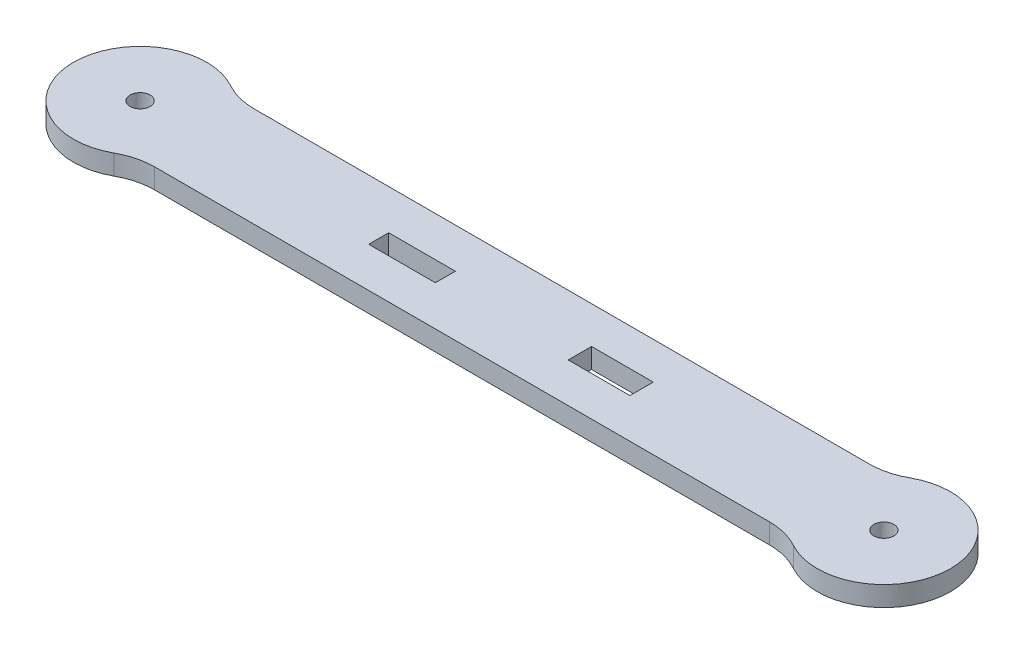
ISO-10303-21;
HEADER;
FILE_DESCRIPTION(('STEP AP214'),'2;1');
FILE_NAME('part.step','',(''),(''),'','','');
FILE_SCHEMA(('AUTOMOTIVE_DESIGN { 1 0 10303 214 1 1 1 1 }'));
ENDSEC;
DATA;
#1=APPLICATION_CONTEXT('core data for automotive mechanical design processes');
#2=APPLICATION_PROTOCOL_DEFINITION('international standard','automotive_design',2000,#1);
#3=PRODUCT_CONTEXT('',#1,'mechanical');
#4=PRODUCT('Part','Part','',(#3));
#5=PRODUCT_RELATED_PRODUCT_CATEGORY('part','',(#4));
#6=PRODUCT_DEFINITION_FORMATION('','',#4);
#7=PRODUCT_DEFINITION_CONTEXT('part definition',#1,'design');
#8=PRODUCT_DEFINITION('design','',#6,#7);
#9=PRODUCT_DEFINITION_SHAPE('','',#8);
#10=(LENGTH_UNIT() NAMED_UNIT(*) SI_UNIT(.MILLI.,.METRE.));
#11=(NAMED_UNIT(*) PLANE_ANGLE_UNIT() SI_UNIT($,.RADIAN.));
#12=(NAMED_UNIT(*) SI_UNIT($,.STERADIAN.) SOLID_ANGLE_UNIT());
#13=UNCERTAINTY_MEASURE_WITH_UNIT(LENGTH_MEASURE(1.E-05),#10,'distance_accuracy_value','');
#14=(GEOMETRIC_REPRESENTATION_CONTEXT(3) GLOBAL_UNCERTAINTY_ASSIGNED_CONTEXT((#13)) GLOBAL_UNIT_ASSIGNED_CONTEXT((#10,
#11,#12)) REPRESENTATION_CONTEXT('',''));
#15=CARTESIAN_POINT('',(0.,0.,0.));
#16=DIRECTION('',(0.,0.,1.));
#17=DIRECTION('',(1.,0.,0.));
#18=AXIS2_PLACEMENT_3D('',#15,#16,#17);
#19=CARTESIAN_POINT('',(-55.805615337507,3.,0.));
#20=DIRECTION('',(0.,1.,0.));
#21=DIRECTION('',(0.,0.,1.));
#22=AXIS2_PLACEMENT_3D('',#19,#20,#21);
#23=PLANE('',#22);
#24=CARTESIAN_POINT('',(-55.805615337507,3.,0.));
#25=DIRECTION('',(0.,1.,0.));
#26=DIRECTION('',(0.,0.,1.));
#27=AXIS2_PLACEMENT_3D('',#24,#25,#26);
#28=CIRCLE('',#27,1.5);
#29=CARTESIAN_POINT('',(-55.805615337507,3.,1.5));
#30=VERTEX_POINT('',#29);
#31=EDGE_CURVE('E259',#30,#30,#28,.T.);
#32=ORIENTED_EDGE('',*,*,#31,.F.);
#33=EDGE_LOOP('',(#32));
#34=FACE_BOUND('',#33,.T.);
#35=DIRECTION('',(-1.,0.,0.));
#36=VECTOR('',#35,1.);
#37=CARTESIAN_POINT('',(-49.1912370598455,3.,-7.5));
#38=LINE('',#37,#36);
#39=CARTESIAN_POINT('',(46.1231569719884,3.,-7.50000000000001));
#40=VERTEX_POINT('',#39);
#41=CARTESIAN_POINT('',(-46.1231569719884,3.,-7.5));
#42=VERTEX_POINT('',#41);
#43=EDGE_CURVE('E279',#40,#42,#38,.T.);
#44=ORIENTED_EDGE('',*,*,#43,.T.);
#45=CARTESIAN_POINT('',(-46.1231569719884,3.,-17.5));
#46=DIRECTION('',(0.,1.,0.));
#47=DIRECTION('',(0.,0.,1.));
#48=AXIS2_PLACEMENT_3D('',#45,#46,#47);
#49=CIRCLE('',#48,10.);
#50=CARTESIAN_POINT('',(-50.9643861547477,3.,-8.75));
#51=VERTEX_POINT('',#50);
#52=EDGE_CURVE('E11',#42,#51,#49,.F.);
#53=ORIENTED_EDGE('',*,*,#52,.T.);
#54=CARTESIAN_POINT('',(-55.805615337507,3.,0.));
#55=DIRECTION('',(0.,1.,0.));
#56=DIRECTION('',(0.,0.,1.));
#57=AXIS2_PLACEMENT_3D('',#54,#55,#56);
#58=CIRCLE('',#57,10.);
#59=CARTESIAN_POINT('',(-50.9643861547477,3.,8.75));
#60=VERTEX_POINT('',#59);
#61=EDGE_CURVE('E267',#51,#60,#58,.T.);
#62=ORIENTED_EDGE('',*,*,#61,.T.);
#63=CARTESIAN_POINT('',(-46.1231569719884,3.,17.5));
#64=DIRECTION('',(0.,1.,0.));
#65=DIRECTION('',(0.,0.,1.));
#66=AXIS2_PLACEMENT_3D('',#63,#64,#65);
#67=CIRCLE('',#66,10.);
#68=CARTESIAN_POINT('',(-46.1231569719884,3.,7.5));
#69=VERTEX_POINT('',#68);
#70=EDGE_CURVE('E331',#60,#69,#67,.F.);
#71=ORIENTED_EDGE('',*,*,#70,.T.);
#72=DIRECTION('',(1.,0.,0.));
#73=VECTOR('',#72,1.);
#74=CARTESIAN_POINT('',(-49.1912370598455,3.,7.5));
#75=LINE('',#74,#73);
#76=CARTESIAN_POINT('',(46.1231569719884,3.,7.49999999999999));
#77=VERTEX_POINT('',#76);
#78=EDGE_CURVE('E271',#69,#77,#75,.T.);
#79=ORIENTED_EDGE('',*,*,#78,.T.);
#80=CARTESIAN_POINT('',(46.1231569719884,3.,17.5));
#81=DIRECTION('',(0.,1.,0.));
#82=DIRECTION('',(0.,0.,1.));
#83=AXIS2_PLACEMENT_3D('',#80,#81,#82);
#84=CIRCLE('',#83,10.);
#85=CARTESIAN_POINT('',(50.9643861547477,3.,8.74999999999999));
#86=VERTEX_POINT('',#85);
#87=EDGE_CURVE('E325',#77,#86,#84,.F.);
#88=ORIENTED_EDGE('',*,*,#87,.T.);
#89=CARTESIAN_POINT('',(55.805615337507,3.,0.));
#90=DIRECTION('',(0.,1.,0.));
#91=DIRECTION('',(0.,0.,1.));
#92=AXIS2_PLACEMENT_3D('',#89,#90,#91);
#93=CIRCLE('',#92,10.);
#94=CARTESIAN_POINT('',(50.9643861547477,3.,-8.75000000000002));
#95=VERTEX_POINT('',#94);
#96=EDGE_CURVE('E276',#86,#95,#93,.T.);
#97=ORIENTED_EDGE('',*,*,#96,.T.);
#98=CARTESIAN_POINT('',(46.1231569719884,3.,-17.5));
#99=DIRECTION('',(0.,1.,0.));
#100=DIRECTION('',(0.,0.,1.));
#101=AXIS2_PLACEMENT_3D('',#98,#99,#100);
#102=CIRCLE('',#101,10.);
#103=EDGE_CURVE('E62',#95,#40,#102,.F.);
#104=ORIENTED_EDGE('',*,*,#103,.T.);
#105=EDGE_LOOP('',(#44,#53,#62,#71,#79,#88,#97,#104));
#106=FACE_BOUND('',#105,.T.);
#107=CARTESIAN_POINT('',(55.805615337507,3.,0.));
#108=DIRECTION('',(0.,1.,0.));
#109=DIRECTION('',(0.,0.,1.));
#110=AXIS2_PLACEMENT_3D('',#107,#108,#109);
#111=CIRCLE('',#110,1.5);
#112=CARTESIAN_POINT('',(55.805615337507,3.,1.49999999999999));
#113=VERTEX_POINT('',#112);
#114=EDGE_CURVE('E251',#113,#113,#111,.T.);
#115=ORIENTED_EDGE('',*,*,#114,.F.);
#116=EDGE_LOOP('',(#115));
#117=FACE_BOUND('',#116,.T.);
#118=DIRECTION('',(1.,0.,0.));
#119=VECTOR('',#118,1.);
#120=CARTESIAN_POINT('',(-20.,3.,1.5));
#121=LINE('',#120,#119);
#122=CARTESIAN_POINT('',(-20.,3.,1.5));
#123=VERTEX_POINT('',#122);
#124=CARTESIAN_POINT('',(-10.,3.,1.50000000000002));
#125=VERTEX_POINT('',#124);
#126=EDGE_CURVE('E211',#123,#125,#121,.T.);
#127=ORIENTED_EDGE('',*,*,#126,.F.);
#128=DIRECTION('',(0.,0.,1.));
#129=VECTOR('',#128,1.);
#130=CARTESIAN_POINT('',(-20.,3.,-1.5));
#131=LINE('',#130,#129);
#132=CARTESIAN_POINT('',(-20.,3.,-1.5));
#133=VERTEX_POINT('',#132);
#134=EDGE_CURVE('E208',#133,#123,#131,.T.);
#135=ORIENTED_EDGE('',*,*,#134,.F.);
#136=DIRECTION('',(-1.,0.,0.));
#137=VECTOR('',#136,1.);
#138=CARTESIAN_POINT('',(-20.,3.,-1.5));
#139=LINE('',#138,#137);
#140=CARTESIAN_POINT('',(-10.,3.,-1.5));
#141=VERTEX_POINT('',#140);
#142=EDGE_CURVE('E219',#141,#133,#139,.T.);
#143=ORIENTED_EDGE('',*,*,#142,.F.);
#144=DIRECTION('',(0.,0.,-1.));
#145=VECTOR('',#144,1.);
#146=CARTESIAN_POINT('',(-10.,3.,-1.5));
#147=LINE('',#146,#145);
#148=EDGE_CURVE('E215',#125,#141,#147,.T.);
#149=ORIENTED_EDGE('',*,*,#148,.F.);
#150=EDGE_LOOP('',(#127,#135,#143,#149));
#151=FACE_BOUND('',#150,.T.);
#152=DIRECTION('',(1.,0.,0.));
#153=VECTOR('',#152,1.);
#154=CARTESIAN_POINT('',(9.99999999999999,3.,1.56405872582707));
#155=LINE('',#154,#153);
#156=CARTESIAN_POINT('',(9.99999999999999,3.,1.56405872582707));
#157=VERTEX_POINT('',#156);
#158=CARTESIAN_POINT('',(19.2592276568958,3.,1.56405872582707));
#159=VERTEX_POINT('',#158);
#160=EDGE_CURVE('E166',#157,#159,#155,.T.);
#161=ORIENTED_EDGE('',*,*,#160,.F.);
#162=DIRECTION('',(0.,0.,1.));
#163=VECTOR('',#162,1.);
#164=CARTESIAN_POINT('',(9.99999999999999,3.,-1.93943282002539));
#165=LINE('',#164,#163);
#166=CARTESIAN_POINT('',(9.99999999999999,3.,-1.93943282002539));
#167=VERTEX_POINT('',#166);
#168=EDGE_CURVE('E155',#167,#157,#165,.T.);
#169=ORIENTED_EDGE('',*,*,#168,.F.);
#170=DIRECTION('',(-1.,0.,0.));
#171=VECTOR('',#170,1.);
#172=CARTESIAN_POINT('',(9.99999999999999,3.,-1.93943282002539));
#173=LINE('',#172,#171);
#174=CARTESIAN_POINT('',(19.2592276568958,3.,-1.93943282002539));
#175=VERTEX_POINT('',#174);
#176=EDGE_CURVE('E184',#175,#167,#173,.T.);
#177=ORIENTED_EDGE('',*,*,#176,.F.);
#178=DIRECTION('',(0.,0.,-1.));
#179=VECTOR('',#178,1.);
#180=CARTESIAN_POINT('',(19.2592276568958,3.,-1.93943282002539));
#181=LINE('',#180,#179);
#182=EDGE_CURVE('E180',#159,#175,#181,.T.);
#183=ORIENTED_EDGE('',*,*,#182,.F.);
#184=EDGE_LOOP('',(#161,#169,#177,#183));
#185=FACE_BOUND('',#184,.T.);
#186=ADVANCED_FACE('F39',(#34,#106,#117,#151,#185),#23,.T.);
#187=CARTESIAN_POINT('',(-55.805615337507,0.,0.));
#188=DIRECTION('',(0.,1.,0.));
#189=DIRECTION('',(0.,0.,1.));
#190=AXIS2_PLACEMENT_3D('',#187,#188,#189);
#191=PLANE('',#190);
#192=DIRECTION('',(0.,0.,1.));
#193=VECTOR('',#192,1.);
#194=CARTESIAN_POINT('',(-20.,0.,-1.5));
#195=LINE('',#194,#193);
#196=CARTESIAN_POINT('',(-20.,0.,-1.5));
#197=VERTEX_POINT('',#196);
#198=CARTESIAN_POINT('',(-20.,0.,1.5));
#199=VERTEX_POINT('',#198);
#200=EDGE_CURVE('E175',#197,#199,#195,.T.);
#201=ORIENTED_EDGE('',*,*,#200,.T.);
#202=DIRECTION('',(1.,0.,0.));
#203=VECTOR('',#202,1.);
#204=CARTESIAN_POINT('',(-20.,0.,1.5));
#205=LINE('',#204,#203);
#206=CARTESIAN_POINT('',(-10.,0.,1.50000000000002));
#207=VERTEX_POINT('',#206);
#208=EDGE_CURVE('E226',#199,#207,#205,.T.);
#209=ORIENTED_EDGE('',*,*,#208,.T.);
#210=DIRECTION('',(0.,0.,-1.));
#211=VECTOR('',#210,1.);
#212=CARTESIAN_POINT('',(-10.,0.,-1.5));
#213=LINE('',#212,#211);
#214=CARTESIAN_POINT('',(-10.,0.,-1.5));
#215=VERTEX_POINT('',#214);
#216=EDGE_CURVE('E230',#207,#215,#213,.T.);
#217=ORIENTED_EDGE('',*,*,#216,.T.);
#218=DIRECTION('',(-1.,0.,0.));
#219=VECTOR('',#218,1.);
#220=CARTESIAN_POINT('',(-20.,0.,-1.5));
#221=LINE('',#220,#219);
#222=EDGE_CURVE('E212',#215,#197,#221,.T.);
#223=ORIENTED_EDGE('',*,*,#222,.T.);
#224=EDGE_LOOP('',(#201,#209,#217,#223));
#225=FACE_BOUND('',#224,.T.);
#226=CARTESIAN_POINT('',(-55.805615337507,0.,0.));
#227=DIRECTION('',(0.,1.,0.));
#228=DIRECTION('',(0.,0.,1.));
#229=AXIS2_PLACEMENT_3D('',#226,#227,#228);
#230=CIRCLE('',#229,10.);
#231=CARTESIAN_POINT('',(-50.9643861547477,0.,-8.75));
#232=VERTEX_POINT('',#231);
#233=CARTESIAN_POINT('',(-50.9643861547477,0.,8.75));
#234=VERTEX_POINT('',#233);
#235=EDGE_CURVE('E263',#232,#234,#230,.T.);
#236=ORIENTED_EDGE('',*,*,#235,.F.);
#237=CARTESIAN_POINT('',(-46.1231569719884,0.,-17.5));
#238=DIRECTION('',(0.,1.,0.));
#239=DIRECTION('',(0.,0.,1.));
#240=AXIS2_PLACEMENT_3D('',#237,#238,#239);
#241=CIRCLE('',#240,10.);
#242=CARTESIAN_POINT('',(-46.1231569719884,0.,-7.5));
#243=VERTEX_POINT('',#242);
#244=EDGE_CURVE('E48',#232,#243,#241,.T.);
#245=ORIENTED_EDGE('',*,*,#244,.T.);
#246=DIRECTION('',(-1.,0.,0.));
#247=VECTOR('',#246,1.);
#248=CARTESIAN_POINT('',(-49.1912370598455,0.,-7.5));
#249=LINE('',#248,#247);
#250=CARTESIAN_POINT('',(46.1231569719884,0.,-7.50000000000001));
#251=VERTEX_POINT('',#250);
#252=EDGE_CURVE('E272',#251,#243,#249,.T.);
#253=ORIENTED_EDGE('',*,*,#252,.F.);
#254=CARTESIAN_POINT('',(46.1231569719884,0.,-17.5));
#255=DIRECTION('',(0.,1.,0.));
#256=DIRECTION('',(0.,0.,1.));
#257=AXIS2_PLACEMENT_3D('',#254,#255,#256);
#258=CIRCLE('',#257,10.);
#259=CARTESIAN_POINT('',(50.9643861547477,0.,-8.75000000000002));
#260=VERTEX_POINT('',#259);
#261=EDGE_CURVE('E334',#251,#260,#258,.T.);
#262=ORIENTED_EDGE('',*,*,#261,.T.);
#263=CARTESIAN_POINT('',(55.805615337507,0.,0.));
#264=DIRECTION('',(0.,1.,0.));
#265=DIRECTION('',(0.,0.,1.));
#266=AXIS2_PLACEMENT_3D('',#263,#264,#265);
#267=CIRCLE('',#266,10.);
#268=CARTESIAN_POINT('',(50.9643861547477,0.,8.74999999999999));
#269=VERTEX_POINT('',#268);
#270=EDGE_CURVE('E290',#269,#260,#267,.T.);
#271=ORIENTED_EDGE('',*,*,#270,.F.);
#272=CARTESIAN_POINT('',(46.1231569719884,0.,17.5));
#273=DIRECTION('',(0.,1.,0.));
#274=DIRECTION('',(0.,0.,1.));
#275=AXIS2_PLACEMENT_3D('',#272,#273,#274);
#276=CIRCLE('',#275,10.);
#277=CARTESIAN_POINT('',(46.1231569719884,0.,7.49999999999999));
#278=VERTEX_POINT('',#277);
#279=EDGE_CURVE('E322',#269,#278,#276,.T.);
#280=ORIENTED_EDGE('',*,*,#279,.T.);
#281=DIRECTION('',(1.,0.,0.));
#282=VECTOR('',#281,1.);
#283=CARTESIAN_POINT('',(-49.1912370598455,0.,7.5));
#284=LINE('',#283,#282);
#285=CARTESIAN_POINT('',(-46.1231569719884,0.,7.5));
#286=VERTEX_POINT('',#285);
#287=EDGE_CURVE('E286',#286,#278,#284,.T.);
#288=ORIENTED_EDGE('',*,*,#287,.F.);
#289=CARTESIAN_POINT('',(-46.1231569719884,0.,17.5));
#290=DIRECTION('',(0.,1.,0.));
#291=DIRECTION('',(0.,0.,1.));
#292=AXIS2_PLACEMENT_3D('',#289,#290,#291);
#293=CIRCLE('',#292,10.);
#294=EDGE_CURVE('E328',#286,#234,#293,.T.);
#295=ORIENTED_EDGE('',*,*,#294,.T.);
#296=EDGE_LOOP('',(#236,#245,#253,#262,#271,#280,#288,#295));
#297=FACE_BOUND('',#296,.T.);
#298=CARTESIAN_POINT('',(-55.805615337507,0.,0.));
#299=DIRECTION('',(0.,1.,0.));
#300=DIRECTION('',(0.,0.,1.));
#301=AXIS2_PLACEMENT_3D('',#298,#299,#300);
#302=CIRCLE('',#301,1.5);
#303=CARTESIAN_POINT('',(-55.805615337507,0.,1.5));
#304=VERTEX_POINT('',#303);
#305=EDGE_CURVE('E255',#304,#304,#302,.T.);
#306=ORIENTED_EDGE('',*,*,#305,.T.);
#307=EDGE_LOOP('',(#306));
#308=FACE_BOUND('',#307,.T.);
#309=CARTESIAN_POINT('',(55.805615337507,0.,0.));
#310=DIRECTION('',(0.,1.,0.));
#311=DIRECTION('',(0.,0.,1.));
#312=AXIS2_PLACEMENT_3D('',#309,#310,#311);
#313=CIRCLE('',#312,1.5);
#314=CARTESIAN_POINT('',(55.805615337507,0.,1.49999999999999));
#315=VERTEX_POINT('',#314);
#316=EDGE_CURVE('E250',#315,#315,#313,.T.);
#317=ORIENTED_EDGE('',*,*,#316,.T.);
#318=EDGE_LOOP('',(#317));
#319=FACE_BOUND('',#318,.T.);
#320=DIRECTION('',(0.,0.,1.));
#321=VECTOR('',#320,1.);
#322=CARTESIAN_POINT('',(9.99999999999999,0.,-1.93943282002539));
#323=LINE('',#322,#321);
#324=CARTESIAN_POINT('',(9.99999999999999,0.,-1.93943282002539));
#325=VERTEX_POINT('',#324);
#326=CARTESIAN_POINT('',(9.99999999999999,0.,1.56405872582707));
#327=VERTEX_POINT('',#326);
#328=EDGE_CURVE('E189',#325,#327,#323,.T.);
#329=ORIENTED_EDGE('',*,*,#328,.T.);
#330=DIRECTION('',(1.,0.,0.));
#331=VECTOR('',#330,1.);
#332=CARTESIAN_POINT('',(9.99999999999999,0.,1.56405872582707));
#333=LINE('',#332,#331);
#334=CARTESIAN_POINT('',(19.2592276568958,0.,1.56405872582707));
#335=VERTEX_POINT('',#334);
#336=EDGE_CURVE('E173',#327,#335,#333,.T.);
#337=ORIENTED_EDGE('',*,*,#336,.T.);
#338=DIRECTION('',(0.,0.,-1.));
#339=VECTOR('',#338,1.);
#340=CARTESIAN_POINT('',(19.2592276568958,0.,-1.93943282002539));
#341=LINE('',#340,#339);
#342=CARTESIAN_POINT('',(19.2592276568958,0.,-1.93943282002539));
#343=VERTEX_POINT('',#342);
#344=EDGE_CURVE('E194',#335,#343,#341,.T.);
#345=ORIENTED_EDGE('',*,*,#344,.T.);
#346=DIRECTION('',(-1.,0.,0.));
#347=VECTOR('',#346,1.);
#348=CARTESIAN_POINT('',(9.99999999999999,0.,-1.93943282002539));
#349=LINE('',#348,#347);
#350=EDGE_CURVE('E167',#343,#325,#349,.T.);
#351=ORIENTED_EDGE('',*,*,#350,.T.);
#352=EDGE_LOOP('',(#329,#337,#345,#351));
#353=FACE_BOUND('',#352,.T.);
#354=ADVANCED_FACE('F342',(#225,#297,#308,#319,#353),#191,.F.);
#355=CARTESIAN_POINT('',(-55.805615337507,3.,0.));
#356=DIRECTION('',(0.,-1.,0.));
#357=DIRECTION('',(0.,0.,-1.));
#358=AXIS2_PLACEMENT_3D('',#355,#356,#357);
#359=CYLINDRICAL_SURFACE('',#358,10.);
#360=ORIENTED_EDGE('',*,*,#235,.T.);
#361=DIRECTION('',(0.,-1.,0.));
#362=VECTOR('',#361,1.);
#363=CARTESIAN_POINT('',(-50.9643861547477,3.,8.75));
#364=LINE('',#363,#362);
#365=EDGE_CURVE('E313',#234,#60,#364,.F.);
#366=ORIENTED_EDGE('',*,*,#365,.T.);
#367=ORIENTED_EDGE('',*,*,#61,.F.);
#368=DIRECTION('',(0.,-1.,0.));
#369=VECTOR('',#368,1.);
#370=CARTESIAN_POINT('',(-50.9643861547477,3.,-8.75));
#371=LINE('',#370,#369);
#372=EDGE_CURVE('E309',#51,#232,#371,.T.);
#373=ORIENTED_EDGE('',*,*,#372,.T.);
#374=EDGE_LOOP('',(#360,#366,#367,#373));
#375=FACE_BOUND('',#374,.T.);
#376=ADVANCED_FACE('F353',(#375),#359,.T.);
#377=CARTESIAN_POINT('',(-49.1912370598455,3.,7.5));
#378=DIRECTION('',(0.,0.,-1.));
#379=DIRECTION('',(-1.,0.,0.));
#380=AXIS2_PLACEMENT_3D('',#377,#378,#379);
#381=PLANE('',#380);
#382=ORIENTED_EDGE('',*,*,#287,.T.);
#383=DIRECTION('',(0.,1.,0.));
#384=VECTOR('',#383,1.);
#385=CARTESIAN_POINT('',(46.1231569719884,3.,7.49999999999999));
#386=LINE('',#385,#384);
#387=EDGE_CURVE('E306',#278,#77,#386,.T.);
#388=ORIENTED_EDGE('',*,*,#387,.T.);
#389=ORIENTED_EDGE('',*,*,#78,.F.);
#390=DIRECTION('',(0.,1.,0.));
#391=VECTOR('',#390,1.);
#392=CARTESIAN_POINT('',(-46.1231569719884,0.,7.5));
#393=LINE('',#392,#391);
#394=EDGE_CURVE('E302',#69,#286,#393,.F.);
#395=ORIENTED_EDGE('',*,*,#394,.T.);
#396=EDGE_LOOP('',(#382,#388,#389,#395));
#397=FACE_BOUND('',#396,.T.);
#398=ADVANCED_FACE('F361',(#397),#381,.F.);
#399=CARTESIAN_POINT('',(55.805615337507,3.,0.));
#400=DIRECTION('',(0.,-1.,0.));
#401=DIRECTION('',(0.,0.,-1.));
#402=AXIS2_PLACEMENT_3D('',#399,#400,#401);
#403=CYLINDRICAL_SURFACE('',#402,10.);
#404=ORIENTED_EDGE('',*,*,#96,.F.);
#405=DIRECTION('',(0.,-1.,0.));
#406=VECTOR('',#405,1.);
#407=CARTESIAN_POINT('',(50.9643861547477,3.,8.74999999999999));
#408=LINE('',#407,#406);
#409=EDGE_CURVE('E298',#86,#269,#408,.T.);
#410=ORIENTED_EDGE('',*,*,#409,.T.);
#411=ORIENTED_EDGE('',*,*,#270,.T.);
#412=DIRECTION('',(0.,-1.,0.));
#413=VECTOR('',#412,1.);
#414=CARTESIAN_POINT('',(50.9643861547477,3.,-8.75000000000002));
#415=LINE('',#414,#413);
#416=EDGE_CURVE('E282',#260,#95,#415,.F.);
#417=ORIENTED_EDGE('',*,*,#416,.T.);
#418=EDGE_LOOP('',(#404,#410,#411,#417));
#419=FACE_BOUND('',#418,.T.);
#420=ADVANCED_FACE('F369',(#419),#403,.T.);
#421=CARTESIAN_POINT('',(-49.1912370598455,3.,-7.5));
#422=DIRECTION('',(0.,0.,1.));
#423=DIRECTION('',(1.,0.,0.));
#424=AXIS2_PLACEMENT_3D('',#421,#422,#423);
#425=PLANE('',#424);
#426=ORIENTED_EDGE('',*,*,#43,.F.);
#427=DIRECTION('',(0.,1.,0.));
#428=VECTOR('',#427,1.);
#429=CARTESIAN_POINT('',(46.1231569719884,0.,-7.50000000000001));
#430=LINE('',#429,#428);
#431=EDGE_CURVE('E318',#40,#251,#430,.F.);
#432=ORIENTED_EDGE('',*,*,#431,.T.);
#433=ORIENTED_EDGE('',*,*,#252,.T.);
#434=DIRECTION('',(0.,1.,0.));
#435=VECTOR('',#434,1.);
#436=CARTESIAN_POINT('',(-46.1231569719884,3.,-7.5));
#437=LINE('',#436,#435);
#438=EDGE_CURVE('E55',#243,#42,#437,.T.);
#439=ORIENTED_EDGE('',*,*,#438,.T.);
#440=EDGE_LOOP('',(#426,#432,#433,#439));
#441=FACE_BOUND('',#440,.T.);
#442=ADVANCED_FACE('F346',(#441),#425,.F.);
#443=CARTESIAN_POINT('',(-55.805615337507,3.,0.));
#444=DIRECTION('',(0.,-1.,0.));
#445=DIRECTION('',(0.,0.,-1.));
#446=AXIS2_PLACEMENT_3D('',#443,#444,#445);
#447=CYLINDRICAL_SURFACE('',#446,1.5);
#448=ORIENTED_EDGE('',*,*,#31,.T.);
#449=EDGE_LOOP('',(#448));
#450=FACE_BOUND('',#449,.T.);
#451=ORIENTED_EDGE('',*,*,#305,.F.);
#452=EDGE_LOOP('',(#451));
#453=FACE_BOUND('',#452,.T.);
#454=ADVANCED_FACE('F390',(#450,#453),#447,.F.);
#455=CARTESIAN_POINT('',(55.805615337507,3.,0.));
#456=DIRECTION('',(0.,-1.,0.));
#457=DIRECTION('',(0.,0.,-1.));
#458=AXIS2_PLACEMENT_3D('',#455,#456,#457);
#459=CYLINDRICAL_SURFACE('',#458,1.5);
#460=ORIENTED_EDGE('',*,*,#114,.T.);
#461=EDGE_LOOP('',(#460));
#462=FACE_BOUND('',#461,.T.);
#463=ORIENTED_EDGE('',*,*,#316,.F.);
#464=EDGE_LOOP('',(#463));
#465=FACE_BOUND('',#464,.T.);
#466=ADVANCED_FACE('F434',(#462,#465),#459,.F.);
#467=CARTESIAN_POINT('',(-20.,3.,-1.5));
#468=DIRECTION('',(1.,0.,0.));
#469=DIRECTION('',(0.,0.,-1.));
#470=AXIS2_PLACEMENT_3D('',#467,#468,#469);
#471=PLANE('',#470);
#472=ORIENTED_EDGE('',*,*,#200,.F.);
#473=DIRECTION('',(0.,-1.,0.));
#474=VECTOR('',#473,1.);
#475=CARTESIAN_POINT('',(-20.,3.,-1.5));
#476=LINE('',#475,#474);
#477=EDGE_CURVE('E222',#133,#197,#476,.T.);
#478=ORIENTED_EDGE('',*,*,#477,.F.);
#479=ORIENTED_EDGE('',*,*,#134,.T.);
#480=DIRECTION('',(0.,-1.,0.));
#481=VECTOR('',#480,1.);
#482=CARTESIAN_POINT('',(-20.,3.,1.5));
#483=LINE('',#482,#481);
#484=EDGE_CURVE('E246',#123,#199,#483,.T.);
#485=ORIENTED_EDGE('',*,*,#484,.T.);
#486=EDGE_LOOP('',(#472,#478,#479,#485));
#487=FACE_BOUND('',#486,.T.);
#488=ADVANCED_FACE('F431',(#487),#471,.T.);
#489=CARTESIAN_POINT('',(-20.,3.,1.5));
#490=DIRECTION('',(0.,0.,-1.));
#491=DIRECTION('',(-1.,0.,0.));
#492=AXIS2_PLACEMENT_3D('',#489,#490,#491);
#493=PLANE('',#492);
#494=ORIENTED_EDGE('',*,*,#208,.F.);
#495=ORIENTED_EDGE('',*,*,#484,.F.);
#496=ORIENTED_EDGE('',*,*,#126,.T.);
#497=DIRECTION('',(0.,-1.,0.));
#498=VECTOR('',#497,1.);
#499=CARTESIAN_POINT('',(-10.,3.,1.50000000000002));
#500=LINE('',#499,#498);
#501=EDGE_CURVE('E243',#125,#207,#500,.T.);
#502=ORIENTED_EDGE('',*,*,#501,.T.);
#503=EDGE_LOOP('',(#494,#495,#496,#502));
#504=FACE_BOUND('',#503,.T.);
#505=ADVANCED_FACE('F427',(#504),#493,.T.);
#506=CARTESIAN_POINT('',(-10.,3.,-1.5));
#507=DIRECTION('',(-1.,0.,0.));
#508=DIRECTION('',(0.,0.,1.));
#509=AXIS2_PLACEMENT_3D('',#506,#507,#508);
#510=PLANE('',#509);
#511=ORIENTED_EDGE('',*,*,#216,.F.);
#512=ORIENTED_EDGE('',*,*,#501,.F.);
#513=ORIENTED_EDGE('',*,*,#148,.T.);
#514=DIRECTION('',(0.,-1.,0.));
#515=VECTOR('',#514,1.);
#516=CARTESIAN_POINT('',(-10.,3.,-1.5));
#517=LINE('',#516,#515);
#518=EDGE_CURVE('E240',#141,#215,#517,.T.);
#519=ORIENTED_EDGE('',*,*,#518,.T.);
#520=EDGE_LOOP('',(#511,#512,#513,#519));
#521=FACE_BOUND('',#520,.T.);
#522=ADVANCED_FACE('F423',(#521),#510,.T.);
#523=CARTESIAN_POINT('',(-20.,3.,-1.5));
#524=DIRECTION('',(0.,0.,1.));
#525=DIRECTION('',(1.,0.,0.));
#526=AXIS2_PLACEMENT_3D('',#523,#524,#525);
#527=PLANE('',#526);
#528=ORIENTED_EDGE('',*,*,#222,.F.);
#529=ORIENTED_EDGE('',*,*,#518,.F.);
#530=ORIENTED_EDGE('',*,*,#142,.T.);
#531=ORIENTED_EDGE('',*,*,#477,.T.);
#532=EDGE_LOOP('',(#528,#529,#530,#531));
#533=FACE_BOUND('',#532,.T.);
#534=ADVANCED_FACE('F420',(#533),#527,.T.);
#535=CARTESIAN_POINT('',(9.99999999999999,3.,-1.93943282002539));
#536=DIRECTION('',(1.,0.,0.));
#537=DIRECTION('',(0.,0.,-1.));
#538=AXIS2_PLACEMENT_3D('',#535,#536,#537);
#539=PLANE('',#538);
#540=ORIENTED_EDGE('',*,*,#328,.F.);
#541=DIRECTION('',(0.,-1.,0.));
#542=VECTOR('',#541,1.);
#543=CARTESIAN_POINT('',(9.99999999999999,3.,-1.93943282002539));
#544=LINE('',#543,#542);
#545=EDGE_CURVE('E161',#167,#325,#544,.T.);
#546=ORIENTED_EDGE('',*,*,#545,.F.);
#547=ORIENTED_EDGE('',*,*,#168,.T.);
#548=DIRECTION('',(0.,-1.,0.));
#549=VECTOR('',#548,1.);
#550=CARTESIAN_POINT('',(9.99999999999999,3.,1.56405872582707));
#551=LINE('',#550,#549);
#552=EDGE_CURVE('E158',#157,#327,#551,.T.);
#553=ORIENTED_EDGE('',*,*,#552,.T.);
#554=EDGE_LOOP('',(#540,#546,#547,#553));
#555=FACE_BOUND('',#554,.T.);
#556=ADVANCED_FACE('F157',(#555),#539,.T.);
#557=CARTESIAN_POINT('',(9.99999999999999,3.,1.56405872582707));
#558=DIRECTION('',(0.,0.,-1.));
#559=DIRECTION('',(-1.,0.,0.));
#560=AXIS2_PLACEMENT_3D('',#557,#558,#559);
#561=PLANE('',#560);
#562=ORIENTED_EDGE('',*,*,#336,.F.);
#563=ORIENTED_EDGE('',*,*,#552,.F.);
#564=ORIENTED_EDGE('',*,*,#160,.T.);
#565=DIRECTION('',(0.,-1.,0.));
#566=VECTOR('',#565,1.);
#567=CARTESIAN_POINT('',(19.2592276568958,3.,1.56405872582707));
#568=LINE('',#567,#566);
#569=EDGE_CURVE('E176',#159,#335,#568,.T.);
#570=ORIENTED_EDGE('',*,*,#569,.T.);
#571=EDGE_LOOP('',(#562,#563,#564,#570));
#572=FACE_BOUND('',#571,.T.);
#573=ADVANCED_FACE('F170',(#572),#561,.T.);
#574=CARTESIAN_POINT('',(19.2592276568958,3.,-1.93943282002539));
#575=DIRECTION('',(-1.,0.,0.));
#576=DIRECTION('',(0.,0.,1.));
#577=AXIS2_PLACEMENT_3D('',#574,#575,#576);
#578=PLANE('',#577);
#579=ORIENTED_EDGE('',*,*,#344,.F.);
#580=ORIENTED_EDGE('',*,*,#569,.F.);
#581=ORIENTED_EDGE('',*,*,#182,.T.);
#582=DIRECTION('',(0.,-1.,0.));
#583=VECTOR('',#582,1.);
#584=CARTESIAN_POINT('',(19.2592276568958,3.,-1.93943282002539));
#585=LINE('',#584,#583);
#586=EDGE_CURVE('E203',#175,#343,#585,.T.);
#587=ORIENTED_EDGE('',*,*,#586,.T.);
#588=EDGE_LOOP('',(#579,#580,#581,#587));
#589=FACE_BOUND('',#588,.T.);
#590=ADVANCED_FACE('F406',(#589),#578,.T.);
#591=CARTESIAN_POINT('',(9.99999999999999,3.,-1.93943282002539));
#592=DIRECTION('',(0.,0.,1.));
#593=DIRECTION('',(1.,0.,0.));
#594=AXIS2_PLACEMENT_3D('',#591,#592,#593);
#595=PLANE('',#594);
#596=ORIENTED_EDGE('',*,*,#350,.F.);
#597=ORIENTED_EDGE('',*,*,#586,.F.);
#598=ORIENTED_EDGE('',*,*,#176,.T.);
#599=ORIENTED_EDGE('',*,*,#545,.T.);
#600=EDGE_LOOP('',(#596,#597,#598,#599));
#601=FACE_BOUND('',#600,.T.);
#602=ADVANCED_FACE('F402',(#601),#595,.T.);
#603=CARTESIAN_POINT('',(46.1231569719884,3.,17.5));
#604=DIRECTION('',(0.,-1.,0.));
#605=DIRECTION('',(0.,0.,-1.));
#606=AXIS2_PLACEMENT_3D('',#603,#604,#605);
#607=CYLINDRICAL_SURFACE('',#606,10.);
#608=ORIENTED_EDGE('',*,*,#87,.F.);
#609=ORIENTED_EDGE('',*,*,#387,.F.);
#610=ORIENTED_EDGE('',*,*,#279,.F.);
#611=ORIENTED_EDGE('',*,*,#409,.F.);
#612=EDGE_LOOP('',(#608,#609,#610,#611));
#613=FACE_BOUND('',#612,.T.);
#614=ADVANCED_FACE('F365',(#613),#607,.F.);
#615=CARTESIAN_POINT('',(-46.1231569719884,3.,17.5));
#616=DIRECTION('',(0.,-1.,0.));
#617=DIRECTION('',(0.,0.,-1.));
#618=AXIS2_PLACEMENT_3D('',#615,#616,#617);
#619=CYLINDRICAL_SURFACE('',#618,10.);
#620=ORIENTED_EDGE('',*,*,#70,.F.);
#621=ORIENTED_EDGE('',*,*,#365,.F.);
#622=ORIENTED_EDGE('',*,*,#294,.F.);
#623=ORIENTED_EDGE('',*,*,#394,.F.);
#624=EDGE_LOOP('',(#620,#621,#622,#623));
#625=FACE_BOUND('',#624,.T.);
#626=ADVANCED_FACE('F356',(#625),#619,.F.);
#627=CARTESIAN_POINT('',(46.1231569719884,3.,-17.5));
#628=DIRECTION('',(0.,-1.,0.));
#629=DIRECTION('',(0.,0.,-1.));
#630=AXIS2_PLACEMENT_3D('',#627,#628,#629);
#631=CYLINDRICAL_SURFACE('',#630,10.);
#632=ORIENTED_EDGE('',*,*,#103,.F.);
#633=ORIENTED_EDGE('',*,*,#416,.F.);
#634=ORIENTED_EDGE('',*,*,#261,.F.);
#635=ORIENTED_EDGE('',*,*,#431,.F.);
#636=EDGE_LOOP('',(#632,#633,#634,#635));
#637=FACE_BOUND('',#636,.T.);
#638=ADVANCED_FACE('F373',(#637),#631,.F.);
#639=CARTESIAN_POINT('',(-46.1231569719884,3.,-17.5));
#640=DIRECTION('',(0.,-1.,0.));
#641=DIRECTION('',(0.,0.,-1.));
#642=AXIS2_PLACEMENT_3D('',#639,#640,#641);
#643=CYLINDRICAL_SURFACE('',#642,10.);
#644=ORIENTED_EDGE('',*,*,#52,.F.);
#645=ORIENTED_EDGE('',*,*,#438,.F.);
#646=ORIENTED_EDGE('',*,*,#244,.F.);
#647=ORIENTED_EDGE('',*,*,#372,.F.);
#648=EDGE_LOOP('',(#644,#645,#646,#647));
#649=FACE_BOUND('',#648,.T.);
#650=ADVANCED_FACE('F41',(#649),#643,.F.);
#651=CLOSED_SHELL('',(#186,#354,#376,#398,#420,#442,#454,#466,#488,#505,#522,#534,#556,#573,
#590,#602,#614,#626,#638,#650));
#652=MANIFOLD_SOLID_BREP('B2',#651);
#653=ADVANCED_BREP_SHAPE_REPRESENTATION('',(#18,#652),#14);
#654=SHAPE_DEFINITION_REPRESENTATION(#9,#653);
ENDSEC;
END-ISO-10303-21;
